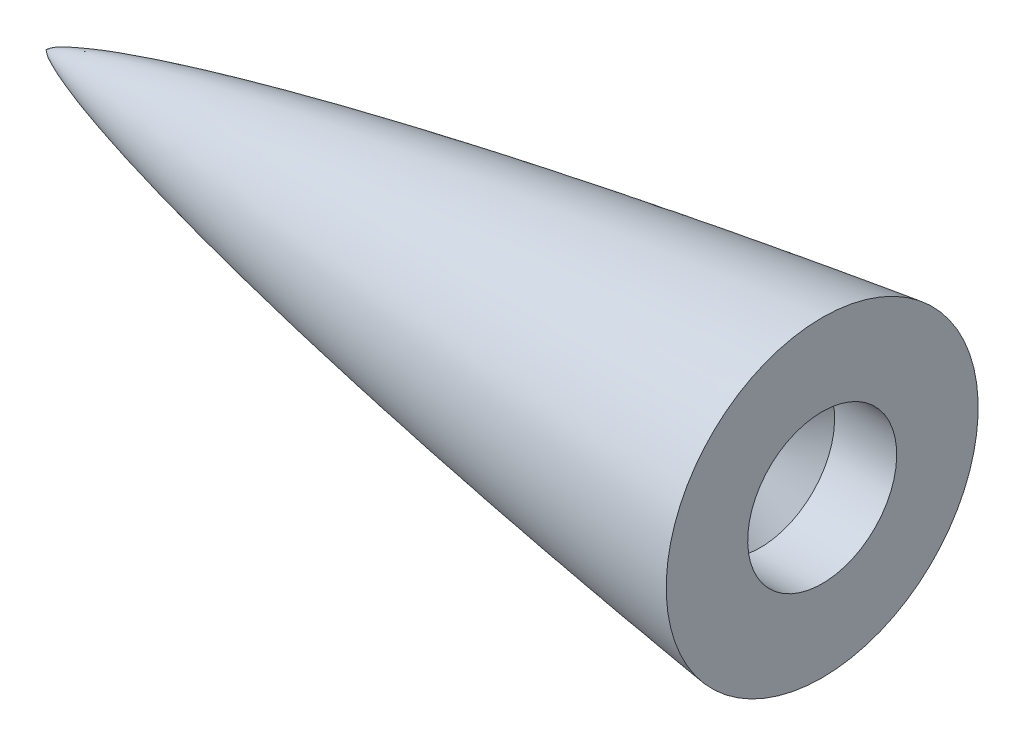
ISO-10303-21;
HEADER;
FILE_DESCRIPTION(('STEP AP214'),'2;1');
FILE_NAME('part.step','',(''),(''),'','','');
FILE_SCHEMA(('AUTOMOTIVE_DESIGN { 1 0 10303 214 1 1 1 1 }'));
ENDSEC;
DATA;
#1=APPLICATION_CONTEXT('core data for automotive mechanical design processes');
#2=APPLICATION_PROTOCOL_DEFINITION('international standard','automotive_design',2000,#1);
#3=PRODUCT_CONTEXT('',#1,'mechanical');
#4=PRODUCT('Part','Part','',(#3));
#5=PRODUCT_RELATED_PRODUCT_CATEGORY('part','',(#4));
#6=PRODUCT_DEFINITION_FORMATION('','',#4);
#7=PRODUCT_DEFINITION_CONTEXT('part definition',#1,'design');
#8=PRODUCT_DEFINITION('design','',#6,#7);
#9=PRODUCT_DEFINITION_SHAPE('','',#8);
#10=(LENGTH_UNIT() NAMED_UNIT(*) SI_UNIT(.MILLI.,.METRE.));
#11=(NAMED_UNIT(*) PLANE_ANGLE_UNIT() SI_UNIT($,.RADIAN.));
#12=(NAMED_UNIT(*) SI_UNIT($,.STERADIAN.) SOLID_ANGLE_UNIT());
#13=UNCERTAINTY_MEASURE_WITH_UNIT(LENGTH_MEASURE(1.E-05),#10,'distance_accuracy_value','');
#14=(GEOMETRIC_REPRESENTATION_CONTEXT(3) GLOBAL_UNCERTAINTY_ASSIGNED_CONTEXT((#13)) GLOBAL_UNIT_ASSIGNED_CONTEXT((#10,
#11,#12)) REPRESENTATION_CONTEXT('',''));
#15=CARTESIAN_POINT('',(0.,0.,0.));
#16=DIRECTION('',(0.,0.,1.));
#17=DIRECTION('',(1.,0.,0.));
#18=AXIS2_PLACEMENT_3D('',#15,#16,#17);
#19=CARTESIAN_POINT('',(0.,0.,0.));
#20=CARTESIAN_POINT('',(0.323780020887397,0.255775241078369,0.));
#21=CARTESIAN_POINT('',(0.940167440278331,0.742700408234434,0.));
#22=CARTESIAN_POINT('',(1.99586647802029,1.20500450304396,0.));
#23=CARTESIAN_POINT('',(2.9891443755303,1.6585574947563,0.));
#24=CARTESIAN_POINT('',(3.99771455141672,2.03983181127441,0.));
#25=CARTESIAN_POINT('',(4.9963829844802,2.41322911768293,0.));
#26=CARTESIAN_POINT('',(5.99863901612366,2.76071011388828,0.));
#27=CARTESIAN_POINT('',(6.99872671672192,3.10038008243236,0.));
#28=CARTESIAN_POINT('',(7.99647459327054,3.43440656378718,0.));
#29=CARTESIAN_POINT('',(9.00081816523889,3.73734633856324,0.));
#30=CARTESIAN_POINT('',(9.99648236750148,4.05503898299552,0.));
#31=CARTESIAN_POINT('',(11.000411881983,4.3386370063871,0.));
#32=CARTESIAN_POINT('',(12.0000264958528,4.62989219414951,0.));
#33=CARTESIAN_POINT('',(12.9986051544376,4.9215380853015,0.));
#34=CARTESIAN_POINT('',(13.9985534469774,5.20195691832947,0.));
#35=CARTESIAN_POINT('',(15.0003334182707,5.46875613142633,0.));
#36=CARTESIAN_POINT('',(15.9984353526339,5.74256519686874,0.));
#37=CARTESIAN_POINT('',(17.0001482189189,5.99945009102783,0.));
#38=CARTESIAN_POINT('',(18.0001446630445,6.25942233061631,0.));
#39=CARTESIAN_POINT('',(18.9984766921585,6.52265059158229,0.));
#40=CARTESIAN_POINT('',(20.000361351775,6.7685531913981,0.));
#41=CARTESIAN_POINT('',(20.998509309663,7.02274455824322,0.));
#42=CARTESIAN_POINT('',(22.0002089755978,7.25914577508987,0.));
#43=CARTESIAN_POINT('',(22.9998827761935,7.50049014654998,0.));
#44=CARTESIAN_POINT('',(24.0002599196283,7.73889363871019,0.));
#45=CARTESIAN_POINT('',(24.9983369265945,7.98375360133974,0.));
#46=CARTESIAN_POINT('',(26.0019384064253,8.2050455229291,0.));
#47=CARTESIAN_POINT('',(26.9969102517336,8.45676294554457,0.));
#48=CARTESIAN_POINT('',(28.0016843871117,8.66589031137831,0.));
#49=CARTESIAN_POINT('',(28.9998897748322,8.90047907289533,0.));
#50=CARTESIAN_POINT('',(29.9987560419627,9.1321954467473,0.));
#51=CARTESIAN_POINT('',(31.0000886415689,9.34961701744224,0.));
#52=CARTESIAN_POINT('',(32.0001743406456,9.5691812228472,0.));
#53=CARTESIAN_POINT('',(32.9985303693005,9.79350448530771,0.));
#54=CARTESIAN_POINT('',(34.0015943584278,9.99591673292078,0.));
#55=CARTESIAN_POINT('',(34.9985171107659,10.2235650355828,0.));
#56=CARTESIAN_POINT('',(36.0002270352643,10.4289406273334,0.));
#57=CARTESIAN_POINT('',(36.9998883550317,10.6405317273191,0.));
#58=CARTESIAN_POINT('',(38.000219544609,10.8489324633901,0.));
#59=CARTESIAN_POINT('',(38.9985789976079,11.0635976965344,0.));
#60=CARTESIAN_POINT('',(40.0015301218619,11.2558691369272,0.));
#61=CARTESIAN_POINT('',(40.9985793142961,11.4735978983808,0.));
#62=CARTESIAN_POINT('',(42.0002178473467,11.6689337563659,0.));
#63=CARTESIAN_POINT('',(42.9998922470854,11.8705389408343,0.));
#64=CARTESIAN_POINT('',(44.0002131643118,12.0689104802971,0.));
#65=CARTESIAN_POINT('',(44.9986301079839,12.2736909497769,0.));
#66=CARTESIAN_POINT('',(46.0015094902387,12.4555924159893,0.));
#67=CARTESIAN_POINT('',(46.9984625439728,12.6645512426057,0.));
#68=CARTESIAN_POINT('',(48.0015094586317,12.8455921048063,0.));
#69=CARTESIAN_POINT('',(48.9986307600539,13.0536894987703,0.));
#70=CARTESIAN_POINT('',(50.0002103177637,13.2389179790492,0.));
#71=CARTESIAN_POINT('',(50.9999006087651,13.430522563333,0.));
#72=CARTESIAN_POINT('',(52.000187247176,13.6189917676189,0.));
#73=CARTESIAN_POINT('',(52.9987551880939,13.8133944889421,0.));
#74=CARTESIAN_POINT('',(54.0012149112962,13.9867663694642,0.));
#75=CARTESIAN_POINT('',(54.9999626307905,14.1802019233818,0.));
#76=CARTESIAN_POINT('',(55.9989344319738,14.3724266587387,0.));
#77=CARTESIAN_POINT('',(57.0001255770618,14.549321163093,0.));
#78=CARTESIAN_POINT('',(57.9999661258012,14.7301831848409,0.));
#79=CARTESIAN_POINT('',(59.0000099197334,14.9099460975432,0.));
#80=CARTESIAN_POINT('',(59.9999941952651,15.0900324249862,0.));
#81=CARTESIAN_POINT('',(61.0000132992063,15.2699242025121,0.));
#82=CARTESIAN_POINT('',(61.9999526079096,15.4502707649654,0.));
#83=CARTESIAN_POINT('',(63.0001762691555,15.6289927376263,0.));
#84=CARTESIAN_POINT('',(63.998777280903,15.8136537984722,0.));
#85=CARTESIAN_POINT('',(65.0013188228629,15.975797021322,0.));
#86=CARTESIAN_POINT('',(65.9987773605775,16.1636533453202,0.));
#87=CARTESIAN_POINT('',(67.0001756793598,16.3289960993631,0.));
#88=CARTESIAN_POINT('',(67.99995298384,16.5002686490075,0.));
#89=CARTESIAN_POINT('',(69.0000123852801,16.6699293046071,0.));
#90=CARTESIAN_POINT('',(69.9999974750394,16.8400141325643,0.));
#91=CARTESIAN_POINT('',(70.9999977145622,17.0100141651359,0.));
#92=CARTESIAN_POINT('',(72.0000116667117,17.1799292068923,0.));
#93=CARTESIAN_POINT('',(72.999955618591,17.3502690072949,0.));
#94=CARTESIAN_POINT('',(74.0001658589244,17.5189947639282,0.));
#95=CARTESIAN_POINT('',(74.9988463848556,17.6936584452655,0.));
#96=CARTESIAN_POINT('',(76.0012362703805,17.8458406031963,0.));
#97=CARTESIAN_POINT('',(76.9988856394752,18.0234205297845,0.));
#98=CARTESIAN_POINT('',(78.0000088884917,18.1799461346581,0.));
#99=CARTESIAN_POINT('',(79.001078777981,18.3367951047628,0.));
#100=CARTESIAN_POINT('',(79.9988883972105,18.5134038960239,0.));
#101=CARTESIAN_POINT('',(81.0001548669461,18.6690610960767,0.));
#102=CARTESIAN_POINT('',(81.9999559029511,18.8302683568656,0.));
#103=CARTESIAN_POINT('',(83.0000215212496,18.9898654764607,0.));
#104=CARTESIAN_POINT('',(83.9999580120505,19.1502697372915,0.));
#105=CARTESIAN_POINT('',(85.0001464305484,19.3090555743733,0.));
#106=CARTESIAN_POINT('',(85.9989524622996,19.4734250563118,0.));
#107=CARTESIAN_POINT('',(87.0010167888937,19.6167732671167,0.));
#108=CARTESIAN_POINT('',(88.0000076396623,19.7799507047079,0.));
#109=CARTESIAN_POINT('',(88.9989526755665,19.943423764938,0.));
#110=CARTESIAN_POINT('',(90.0011543081678,20.0858860020574,0.));
#111=CARTESIAN_POINT('',(90.9989527575847,20.2534232327909,0.));
#112=CARTESIAN_POINT('',(92.0000076124893,20.3999508919617,0.));
#113=CARTESIAN_POINT('',(93.0010167693962,20.5467733481348,0.));
#114=CARTESIAN_POINT('',(93.9989524512479,20.7134252947767,0.));
#115=CARTESIAN_POINT('',(95.0001459585646,20.8590579956404,0.));
#116=CARTESIAN_POINT('',(95.999958451924,21.010269227626,0.));
#117=CARTESIAN_POINT('',(97.0000202337396,21.1598650938555,0.));
#118=CARTESIAN_POINT('',(97.9999606131178,21.3102703969518,0.));
#119=CARTESIAN_POINT('',(99.0001373137893,21.4590533183373,0.));
#120=CARTESIAN_POINT('',(99.9990174045867,21.6134432635547,0.));
#121=CARTESIAN_POINT('',(101.00095308829,21.7467601736101,0.));
#122=CARTESIAN_POINT('',(102.00001051548,21.8999274712614,0.));
#123=CARTESIAN_POINT('',(102.999004879635,22.0535297354932,0.));
#124=CARTESIAN_POINT('',(104.00112957346,22.185542980329,0.));
#125=CARTESIAN_POINT('',(104.998843482188,22.3446428470258,0.));
#126=CARTESIAN_POINT('',(106.001129650996,22.4755424458966,0.));
#127=CARTESIAN_POINT('',(106.999004951579,22.633529238071,0.));
#128=CARTESIAN_POINT('',(108.000010502408,22.7699275660932,0.));
#129=CARTESIAN_POINT('',(109.000953008938,22.9067607034301,0.));
#130=CARTESIAN_POINT('',(109.999017621604,23.0634418318312,0.));
#131=CARTESIAN_POINT('',(111.000136053249,23.1990617687087,0.));
#132=CARTESIAN_POINT('',(111.999964154621,23.3402468798406,0.));
#133=CARTESIAN_POINT('',(113.000007328267,23.4799507119288,0.));
#134=CARTESIAN_POINT('',(114.000006532313,23.619950272444,0.));
#135=CARTESIAN_POINT('',(114.999966542483,23.7602481982951,0.));
#136=CARTESIAN_POINT('',(116.000127297756,23.8990569343756,0.));
#137=CARTESIAN_POINT('',(116.999082890696,24.043460261433,0.));
#138=CARTESIAN_POINT('',(118.000889733957,24.1667425427165,0.));
#139=CARTESIAN_POINT('',(119.000009833305,24.3099271607634,0.));
#140=CARTESIAN_POINT('',(119.999070958879,24.4535486212167,0.));
#141=CARTESIAN_POINT('',(121.001054567191,24.5755215328486,0.));
#142=CARTESIAN_POINT('',(121.998920281029,24.7246647812938,0.));
#143=CARTESIAN_POINT('',(123.001054633441,24.8455210420068,0.));
#144=CARTESIAN_POINT('',(123.999071026904,24.9935481176773,0.));
#145=CARTESIAN_POINT('',(125.000009801949,25.119927391691,0.));
#146=CARTESIAN_POINT('',(126.000889739294,25.2467425082154,0.));
#147=CARTESIAN_POINT('',(126.999082801973,25.3934608999027,0.));
#148=CARTESIAN_POINT('',(128.000127237149,25.5190574535096,0.));
#149=CARTESIAN_POINT('',(128.999965755197,25.6502537682925,0.));
#150=CARTESIAN_POINT('',(130.000009742062,25.7799274733206,0.));
#151=CARTESIAN_POINT('',(130.999995276554,25.9100363384253,0.));
#152=CARTESIAN_POINT('',(132.000009151721,26.0399271729781,0.));
#153=CARTESIAN_POINT('',(132.999968116563,26.1702549696623,0.));
#154=CARTESIAN_POINT('',(134.000118382027,26.2990529483729,0.));
#155=CARTESIAN_POINT('',(134.999148590769,26.4334781007121,0.));
#156=CARTESIAN_POINT('',(136.00082595212,26.5467255557261,0.));
#157=CARTESIAN_POINT('',(137.000009123058,26.6799270132021,0.));
#158=CARTESIAN_POINT('',(137.99913757809,26.8135662119206,0.));
#159=CARTESIAN_POINT('',(139.00097895256,26.9255015200354,0.));
#160=CARTESIAN_POINT('',(139.99899770112,27.0646852550941,0.));
#161=CARTESIAN_POINT('',(141.000979009967,27.1755010608001,0.));
#162=CARTESIAN_POINT('',(141.99913763544,27.3135657529733,0.));
#163=CARTESIAN_POINT('',(143.000009100803,27.4299271917738,0.));
#164=CARTESIAN_POINT('',(144.000825938934,27.5467256592578,0.));
#165=CARTESIAN_POINT('',(144.999148580649,27.6834781889812,0.));
#166=CARTESIAN_POINT('',(146.000118081977,27.7990553215228,0.));
#167=CARTESIAN_POINT('',(146.99996836299,27.9202531000893,0.));
#168=CARTESIAN_POINT('',(148.000008466062,28.03993227812,0.));
#169=CARTESIAN_POINT('',(148.999997772763,28.1600177874309,0.));
#170=CARTESIAN_POINT('',(150.000000442888,28.2799965721566,0.));
#171=CARTESIAN_POINT('',(151.000000455687,28.3999959239429,0.));
#172=CARTESIAN_POINT('',(151.999997734364,28.520019732072,0.));
#173=CARTESIAN_POINT('',(153.000008606857,28.6399251477691,0.));
#174=CARTESIAN_POINT('',(153.999967838206,28.7602796768517,0.));
#175=CARTESIAN_POINT('',(155.000120040316,28.8789561448239,0.));
#176=CARTESIAN_POINT('',(155.999174109169,29.0038485034232,0.));
#177=CARTESIAN_POINT('',(157.000913634555,29.105388488964,0.));
#178=CARTESIAN_POINT('',(157.999062851381,29.2348159861766,0.));
#179=CARTESIAN_POINT('',(159.000943327822,29.3351302803103,0.));
#180=CARTESIAN_POINT('',(159.999055434339,29.4648804837719,0.));
#181=CARTESIAN_POINT('',(161.000943330796,29.5651302544485,0.));
#182=CARTESIAN_POINT('',(161.999062853516,29.694815967602,0.));
#183=CARTESIAN_POINT('',(163.000913679169,29.7953881010382,0.));
#184=CARTESIAN_POINT('',(163.999174139061,29.9238482433789,0.));
#185=CARTESIAN_POINT('',(165.000119803179,30.0289582073525,0.));
#186=CARTESIAN_POINT('',(165.999967898109,30.1402791544115,0.));
#187=CARTESIAN_POINT('',(167.000008604385,30.2499251750013,0.));
#188=CARTESIAN_POINT('',(167.999997684352,30.3600201455834,0.));
#189=CARTESIAN_POINT('',(169.000000658206,30.4699942426651,0.));
#190=CARTESIAN_POINT('',(169.999999682824,30.5800028837563,0.));
#191=CARTESIAN_POINT('',(171.000000610498,30.6899942223099,0.));
#192=CARTESIAN_POINT('',(171.999997875184,30.8000202270043,0.));
#193=CARTESIAN_POINT('',(173.000007888766,30.9099248696732,0.));
#194=CARTESIAN_POINT('',(173.999970569752,31.0202802943031,0.));
#195=CARTESIAN_POINT('',(175.000109832227,31.1289539531143,0.));
#196=CARTESIAN_POINT('',(175.999244285965,31.2438641211122,0.));
#197=CARTESIAN_POINT('',(177.000836004758,31.3353711863905,0.));
#198=CARTESIAN_POINT('',(177.99914248156,31.4548337108929,0.));
#199=CARTESIAN_POINT('',(179.000863170811,31.5451124556522,0.));
#200=CARTESIAN_POINT('',(179.999135704011,31.6648982606242,0.));
#201=CARTESIAN_POINT('',(181.000863138489,31.75511276333,0.));
#202=CARTESIAN_POINT('',(181.999142622705,31.8748323672917,0.));
#203=CARTESIAN_POINT('',(183.000835519916,31.9653758015584,0.));
#204=CARTESIAN_POINT('',(183.999246261986,32.0838453106908,0.));
#205=CARTESIAN_POINT('',(185.000102360935,32.179025075384,0.));
#206=CARTESIAN_POINT('',(185.99999776307,32.2800214332274,0.));
#207=CARTESIAN_POINT('',(186.999906586783,32.3808891917066,0.));
#208=CARTESIAN_POINT('',(188.000722407055,32.4764548881151,0.));
#209=CARTESIAN_POINT('',(188.999280935262,32.5935083786063,0.));
#210=CARTESIAN_POINT('',(190.00007672591,32.6892942078649,0.));
#211=CARTESIAN_POINT('',(191.000065650777,32.7892816255474,0.));
#212=CARTESIAN_POINT('',(191.999347119071,32.8935465739644,0.));
#213=CARTESIAN_POINT('',(193.000662965168,32.9763526207561,0.));
#214=CARTESIAN_POINT('',(193.999883861523,33.0812230656851,0.));
#215=CARTESIAN_POINT('',(195.000115121645,33.178788022476,0.));
#216=CARTESIAN_POINT('',(195.999342117077,33.2835919593074,0.));
#217=CARTESIAN_POINT('',(197.000633581217,33.366663882023,0.));
#218=CARTESIAN_POINT('',(198.000006547159,33.4699310835378,0.));
#219=CARTESIAN_POINT('',(198.99934024247,33.57361165412,0.));
#220=CARTESIAN_POINT('',(200.000749444591,33.6554442476242,0.));
#221=CARTESIAN_POINT('',(200.999231026767,33.7647613223023,0.));
#222=CARTESIAN_POINT('',(202.000757308872,33.8453614633098,0.));
#223=CARTESIAN_POINT('',(202.99930893216,33.9539412459336,0.));
#224=CARTESIAN_POINT('',(204.000123948022,34.0386952489818,0.));
#225=CARTESIAN_POINT('',(204.999881144082,34.1312511559038,0.));
#226=CARTESIAN_POINT('',(206.000665597728,34.2163268306034,0.));
#227=CARTESIAN_POINT('',(206.999339541847,34.3236191691468,0.));
#228=CARTESIAN_POINT('',(208.000093191885,34.4090184897275,0.));
#229=CARTESIAN_POINT('',(208.999973578202,34.5002800671583,0.));
#230=CARTESIAN_POINT('',(210.000012495305,34.5898612416392,0.));
#231=CARTESIAN_POINT('',(210.999976440576,34.6802749662848,0.));
#232=CARTESIAN_POINT('',(212.000081742389,34.7690388932218,0.));
#233=CARTESIAN_POINT('',(212.999415522799,34.8635428811616,0.));
#234=CARTESIAN_POINT('',(214.000568484554,34.9366451562588,0.));
#235=CARTESIAN_POINT('',(214.999998315379,35.0300198081694,0.));
#236=CARTESIAN_POINT('',(215.999438251088,35.1232756444808,0.));
#237=CARTESIAN_POINT('',(217.000560915238,35.1967341659276,0.));
#238=CARTESIAN_POINT('',(218.00000585792,35.2899310817981,0.));
#239=CARTESIAN_POINT('',(218.999415662964,35.3835413906112,0.));
#240=CARTESIAN_POINT('',(220.000643680752,35.4557604306458,0.));
#241=CARTESIAN_POINT('',(220.999416084509,35.553536431245,0.));
#242=CARTESIAN_POINT('',(222.000004263714,35.6299498372023,0.));
#243=CARTESIAN_POINT('',(223.000566853437,35.7066643046445,0.));
#244=CARTESIAN_POINT('',(223.999416068847,35.8035366124538,0.));
#245=CARTESIAN_POINT('',(225.000081024051,35.8790467633719,0.));
#246=CARTESIAN_POINT('',(225.999978314306,35.9602550905182,0.));
#247=CARTESIAN_POINT('',(227.000005718728,36.0399328745553,0.));
#248=CARTESIAN_POINT('',(227.999998810784,36.1200134112607,0.));
#249=CARTESIAN_POINT('',(228.999999038136,36.200013480402,0.));
#250=CARTESIAN_POINT('',(230.000005036672,36.2799326671315,0.));
#251=CARTESIAN_POINT('',(230.999980815175,36.3602558510721,0.));
#252=CARTESIAN_POINT('',(232.000071702628,36.4390439285801,0.));
#253=CARTESIAN_POINT('',(232.99948395583,36.5235474300306,0.));
#254=CARTESIAN_POINT('',(234.000500965727,36.5866536233432,0.));
#255=CARTESIAN_POINT('',(235.000003768349,36.6699497543356,0.));
#256=CARTESIAN_POINT('',(235.999483966494,36.7535472843972,0.));
#257=CARTESIAN_POINT('',(237.000568756118,36.8157497298935,0.));
#258=CARTESIAN_POINT('',(237.999483986515,36.9035470175816,0.));
#259=CARTESIAN_POINT('',(239.000003761308,36.96994984772,0.));
#260=CARTESIAN_POINT('',(240.000500962643,37.0366536663721,0.));
#261=CARTESIAN_POINT('',(240.999483947094,37.1235475394051,0.));
#262=CARTESIAN_POINT('',(242.000071611276,37.1890451731743,0.));
#263=CARTESIAN_POINT('',(242.999980835321,37.2602554834586,0.));
#264=CARTESIAN_POINT('',(244.00000504744,37.3299328929912,0.));
#265=CARTESIAN_POINT('',(244.999998974919,37.4000129445766,0.));
#266=CARTESIAN_POINT('',(245.999999052883,37.4700153287023,0.));
#267=CARTESIAN_POINT('',(247.000004813551,37.5399257406143,0.));
#268=CARTESIAN_POINT('',(247.999981692915,37.6102817088406,0.));
#269=CARTESIAN_POINT('',(249.000068414788,37.6789474240234,0.));
#270=CARTESIAN_POINT('',(249.999529037808,37.7539124231305,0.));
#271=CARTESIAN_POINT('',(251.000520947229,37.805318559985,0.));
#272=CARTESIAN_POINT('',(251.999465888063,37.8848839783196,0.));
#273=CARTESIAN_POINT('',(253.000536743146,37.9350755405134,0.));
#274=CARTESIAN_POINT('',(253.999465888207,38.0148839769165,0.));
#275=CARTESIAN_POINT('',(255.000520963684,38.0653183035788,0.));
#276=CARTESIAN_POINT('',(255.999529039968,38.1439124020842,0.));
#277=CARTESIAN_POINT('',(257.00006836588,38.1989481310445,0.));
#278=CARTESIAN_POINT('',(257.99998160711,38.2602831985117,0.));
#279=CARTESIAN_POINT('',(259.000005205678,38.3199190749085,0.));
#280=CARTESIAN_POINT('',(259.999997570176,38.3800405018543,0.));
#281=CARTESIAN_POINT('',(261.000004513617,38.4399189176743,0.));
#282=CARTESIAN_POINT('',(261.999984375355,38.5002838274485,0.));
#283=CARTESIAN_POINT('',(263.000057984962,38.5589457725319,0.));
#284=CARTESIAN_POINT('',(263.999601009135,38.6239212075669,0.));
#285=CARTESIAN_POINT('',(265.000441331696,38.6653089270093,0.));
#286=CARTESIAN_POINT('',(265.999547519095,38.7348937912328,0.));
#287=CARTESIAN_POINT('',(267.000454706354,38.7750657567894,0.));
#288=CARTESIAN_POINT('',(267.999547534952,38.8448934438272,0.));
#289=CARTESIAN_POINT('',(269.000441280514,38.8853100938704,0.));
#290=CARTESIAN_POINT('',(269.999601246991,38.953915996482,0.));
#291=CARTESIAN_POINT('',(271.000057068166,38.9989657486842,0.));
#292=CARTESIAN_POINT('',(271.999987604439,39.0502127740205,0.));
#293=CARTESIAN_POINT('',(272.99999251408,39.1001831552339,0.));
#294=CARTESIAN_POINT('',(274.000042339241,39.1490546050439,0.));
#295=CARTESIAN_POINT('',(274.999688499988,39.2035902615881,0.));
#296=CARTESIAN_POINT('',(276.000305523638,39.2365434479416,0.));
#297=CARTESIAN_POINT('',(276.999987561426,39.2902764268363,0.));
#298=CARTESIAN_POINT('',(277.999744219491,39.3423510929327,0.));
#299=CARTESIAN_POINT('',(278.99998770852,39.3802720516552,0.));
#300=CARTESIAN_POINT('',(280.000304957471,39.4165604560462,0.));
#301=CARTESIAN_POINT('',(280.999690624,39.4735264571226,0.));
#302=CARTESIAN_POINT('',(282.000034370243,39.5092936556209,0.));
#303=CARTESIAN_POINT('',(283.000022139228,39.5492935658888,0.));
#304=CARTESIAN_POINT('',(283.99976058909,39.5935269270077,0.));
#305=CARTESIAN_POINT('',(285.000236387071,39.6165739750987,0.));
#306=CARTESIAN_POINT('',(285.999992987368,39.6602016766098,0.));
#307=CARTESIAN_POINT('',(286.999791658556,39.7026194594347,0.));
#308=CARTESIAN_POINT('',(288.000024718304,39.729292309718,0.));
#309=CARTESIAN_POINT('',(288.999992913261,39.7602081935645,0.));
#310=CARTESIAN_POINT('',(290.000003628653,39.7898749160238,0.));
#311=CARTESIAN_POINT('',(290.999992572128,39.8202921423401,0.));
#312=CARTESIAN_POINT('',(292.000026082836,39.8489565146159,0.));
#313=CARTESIAN_POINT('',(292.999819837969,39.8838788910099,0.));
#314=CARTESIAN_POINT('',(294.000194892896,39.8955153204743,0.));
#315=CARTESIAN_POINT('',(294.999816985873,39.9340702766527,0.));
#316=CARTESIAN_POINT('',(296.000037481987,39.9481914297313,0.));
#317=CARTESIAN_POINT('',(296.999899805772,39.9731615802105,0.));
#318=CARTESIAN_POINT('',(298.000013386612,39.9791568320251,0.));
#319=CARTESIAN_POINT('',(298.999996653347,39.9902107919937,0.));
#320=CARTESIAN_POINT('',(299.666665551116,39.9967369306646,0.));
#321=CARTESIAN_POINT('',(300.,40.,0.));
#322=B_SPLINE_CURVE_WITH_KNOTS('',3,(#19,#20,#21,#22,#23,#24,#25,#26,#27,#28,#29,#30,#31,#32,
#33,#34,#35,#36,#37,#38,#39,#40,#41,#42,#43,#44,#45,#46,#47,#48,#49,#50,#51,#52,#53,#54,#55,#56,
#57,#58,#59,#60,#61,#62,#63,#64,#65,#66,#67,#68,#69,#70,#71,#72,#73,#74,#75,#76,#77,#78,#79,#80,
#81,#82,#83,#84,#85,#86,#87,#88,#89,#90,#91,#92,#93,#94,#95,#96,#97,#98,#99,#100,#101,#102,#103,
#104,#105,#106,#107,#108,#109,#110,#111,#112,#113,#114,#115,#116,#117,#118,#119,#120,#121,#122,
#123,#124,#125,#126,#127,#128,#129,#130,#131,#132,#133,#134,#135,#136,#137,#138,#139,#140,#141,
#142,#143,#144,#145,#146,#147,#148,#149,#150,#151,#152,#153,#154,#155,#156,#157,#158,#159,#160,
#161,#162,#163,#164,#165,#166,#167,#168,#169,#170,#171,#172,#173,#174,#175,#176,#177,#178,#179,
#180,#181,#182,#183,#184,#185,#186,#187,#188,#189,#190,#191,#192,#193,#194,#195,#196,#197,#198,
#199,#200,#201,#202,#203,#204,#205,#206,#207,#208,#209,#210,#211,#212,#213,#214,#215,#216,#217,
#218,#219,#220,#221,#222,#223,#224,#225,#226,#227,#228,#229,#230,#231,#232,#233,#234,#235,#236,
#237,#238,#239,#240,#241,#242,#243,#244,#245,#246,#247,#248,#249,#250,#251,#252,#253,#254,#255,
#256,#257,#258,#259,#260,#261,#262,#263,#264,#265,#266,#267,#268,#269,#270,#271,#272,#273,#274,
#275,#276,#277,#278,#279,#280,#281,#282,#283,#284,#285,#286,#287,#288,#289,#290,#291,#292,#293,
#294,#295,#296,#297,#298,#299,#300,#301,#302,#303,#304,#305,#306,#307,#308,#309,#310,#311,#312,
#313,#314,#315,#316,#317,#318,#319,#320,#321),.UNSPECIFIED.,.F.,.F.,(4,1,1,1,1,1,1,1,1,1,1,1,1,
1,1,1,1,1,1,1,1,1,1,1,1,1,1,1,1,1,1,1,1,1,1,1,1,1,1,1,1,1,1,1,1,1,1,1,1,1,1,1,1,1,1,1,1,1,1,1,1,
1,1,1,1,1,1,1,1,1,1,1,1,1,1,1,1,1,1,1,1,1,1,1,1,1,1,1,1,1,1,1,1,1,1,1,1,1,1,1,1,1,1,1,1,1,1,1,1,
1,1,1,1,1,1,1,1,1,1,1,1,1,1,1,1,1,1,1,1,1,1,1,1,1,1,1,1,1,1,1,1,1,1,1,1,1,1,1,1,1,1,1,1,1,1,1,1,
1,1,1,1,1,1,1,1,1,1,1,1,1,1,1,1,1,1,1,1,1,1,1,1,1,1,1,1,1,1,1,1,1,1,1,1,1,1,1,1,1,1,1,1,1,1,1,1,
1,1,1,1,1,1,1,1,1,1,1,1,1,1,1,1,1,1,1,1,1,1,1,1,1,1,1,1,1,1,1,1,1,1,1,1,1,1,1,1,1,1,1,1,1,1,1,1,
1,1,1,1,1,1,1,1,1,1,1,1,1,1,1,1,1,1,1,1,1,1,1,1,1,1,1,1,1,1,1,1,1,1,1,1,1,1,1,1,1,1,1,1,1,1,1,
4),(0.,0.00405928364621406,0.00772775097242914,0.0113267829602198,0.0148626944872316,
0.0183752033991811,0.021865396666398,0.0253448463005576,0.0288138318705567,0.0322627381295801,
0.0357116443886035,0.0391416195399031,0.0425715946912028,0.0460015698425024,0.0494225160182203,
0.0528347273759571,0.0562469387336939,0.0596507116956672,0.0630544846576405,0.0664582576196138,
0.0698538908179343,0.0732495240162549,0.0766373182355804,0.0800251124549059,0.0834129066742315,
0.086800700893557,0.0901809590111477,0.0935687532304732,0.0969417801536779,0.100322038271269,
0.103702296388859,0.107075323312064,0.110448350235269,0.113821377158473,0.117187479759683,
0.120560506682888,0.123926609284098,0.127292711885308,0.130658814486518,0.134024917087728,
0.137384404136842,0.140750506738052,0.144109993787166,0.14746948083628,0.150828967885394,
0.154188454934508,0.157541637028959,0.160901124078073,0.164254306172523,0.167613793221637,
0.170966975316087,0.174320157410537,0.177673339504987,0.181026521599437,0.184373711091832,
0.187726893186282,0.191080075280732,0.194427264773127,0.197774454265522,0.201121643757917,
0.204468833250312,0.207816022742707,0.211163212235102,0.214510401727497,0.217857591219892,
0.221199102143343,0.224546291635738,0.227887802559189,0.23122931348264,0.234570824406091,
0.237912335329542,0.241253846252993,0.244595357176444,0.247936868099895,0.251278379023346,
0.254619889946797,0.257956037937994,0.261297548861445,0.264633696852641,0.267969844843838,
0.271311355767289,0.274647503758486,0.277983651749683,0.28131979974088,0.284655947732077,
0.287992095723274,0.291328243714471,0.294659345934589,0.297995493925786,0.301331641916983,
0.304662744137101,0.307998892128298,0.311329994348416,0.314661096568534,0.317997244559731,
0.321328346779849,0.324659448999968,0.327990551220086,0.331321653440204,0.334652755660322,
0.33798385788044,0.341310232933958,0.344641335154077,0.347972437374195,0.351298812427713,
0.354629914647831,0.357956289701349,0.361287391921468,0.364613766974986,0.367940142028504,
0.371271244248622,0.37459761930214,0.377923994355659,0.381250369409177,0.384576744462695,
0.387903119516213,0.391229494569732,0.39455586962325,0.397877837474772,0.40120421252829,
0.404530587581808,0.40785255543333,0.411178930486848,0.41450089833837,0.417827273391888,
0.42114924124341,0.424471209094931,0.42779758414845,0.431119551999971,0.434441519851493,
0.437763487703015,0.441085455554537,0.444407423406058,0.44772939125758,0.451051359109102,
0.454373326960624,0.457691208849797,0.461013176701318,0.46433514455284,0.467653026442013,
0.470974994293535,0.474292876182708,0.47761484403423,0.480932725923403,0.484250607812576,
0.487572575664098,0.490890457553271,0.494208339442444,0.497526221331617,0.50084410322079,
0.504161985109963,0.507479866999136,0.510797748888309,0.514115630777482,0.517433512666655,
0.520751394555828,0.524069276445001,0.527383394799638,0.530701276688812,0.534015395043449,
0.537333276932622,0.540647395287259,0.543965277176433,0.54727939553107,0.550597277420243,
0.55391139577488,0.557225514129518,0.560539632484155,0.563853750838793,0.56716786919343,
0.570481987548067,0.573796105902705,0.577110224257342,0.58042434261198,0.583738460966617,
0.587052579321254,0.590366697675892,0.593677376023402,0.596991494378039,0.600302172725549,
0.603616291080186,0.606926969427696,0.610241087782333,0.613551766129843,0.616865884484481,
0.62017656283199,0.6234872411795,0.62679791952701,0.63010859787452,0.633422716229157,
0.636733394576667,0.640044072924177,0.643354751271686,0.646662314148924,0.649972992496433,
0.653283670843943,0.656594349191453,0.65990191206869,0.6632125904162,0.66652326876371,
0.669830831640947,0.673141509988457,0.676449072865694,0.679759751213204,0.683067314090441,
0.686374876967679,0.689682439844916,0.692993118192426,0.696300681069663,0.6996082439469,
0.702915806824138,0.706223369701375,0.709530932578612,0.71283849545585,0.716143268317511,
0.719450831194748,0.722758394071985,0.726063166933646,0.729370729810884,0.732678292688121,
0.735983065549782,0.739290628427019,0.74259540128868,0.745900174150341,0.749207737027578,
0.752512509889239,0.7558172827509,0.759122055612561,0.762426828474222,0.765731601335883,
0.769036374197544,0.772341147059205,0.775645919920866,0.778950692782527,0.782253001908206,
0.785557774769867,0.788862547631528,0.792164856757207,0.795469629618868,0.798771938744548,
0.802074247870227,0.805379020731888,0.808681329857567,0.811983638983247,0.815285948108926,
0.818588257234606,0.821890566360285,0.825192875485965,0.828495184611644,0.831797493737323,
0.835099802863003,0.838399975263046,0.841702284388725,0.845002456788768,0.848304765914447,
0.85160493831449,0.854907247440169,0.858207419840212,0.861507592240255,0.864807764640298,
0.868107937040341,0.871408109440384,0.874708281840427,0.87800845424047,0.881308626640512,
0.884606989960789,0.887907162360832,0.891205525681109,0.894505698081152,0.897804061401428,
0.901104233801471,0.904402597121748,0.907700960442024,0.910999323762301,0.914297687082578,
0.917596050402854,0.920892932828597,0.924191296148874,0.92748965946915,0.930786541894893,
0.934083424320636,0.937381787640912,0.940678670066655,0.943975552492398,0.94727243491814,
0.950568165076979,0.953865047502722,0.957161929928464,0.960457660087303,0.963753390246142,
0.967049120404981,0.97034485056382,0.973640580722659,0.976936310881498,0.980231217745837,
0.983526947904676,0.986821854769016,0.990116761633355,0.993411174422237,0.996705587211118,1.),.UNSPECIFIED.);
#323=CARTESIAN_POINT('',(1365.99999999999,1.69593505905396E-13,0.));
#324=DIRECTION('',(1.,0.,0.));
#325=AXIS1_PLACEMENT('',#323,#324);
#326=SURFACE_OF_REVOLUTION('',#322,#325);
#327=CARTESIAN_POINT('',(125.,-1.51978667774186E-13,0.));
#328=DIRECTION('',(1.,0.,0.));
#329=DIRECTION('',(0.,1.,0.));
#330=AXIS2_PLACEMENT_3D('',#327,#328,#329);
#331=CIRCLE('',#330,25.1200000000002);
#332=CARTESIAN_POINT('',(125.,25.12,0.));
#333=VERTEX_POINT('',#332);
#334=EDGE_CURVE('E69',#333,#333,#331,.T.);
#335=ORIENTED_EDGE('',*,*,#334,.F.);
#336=EDGE_LOOP('',(#335));
#337=FACE_BOUND('',#336,.T.);
#338=CARTESIAN_POINT('',(0.,0.,0.));
#339=VERTEX_POINT('',#338);
#340=VERTEX_LOOP('',#339);
#341=FACE_BOUND('',#340,.T.);
#342=ADVANCED_FACE('F45',(#337,#341),#326,.T.);
#343=CARTESIAN_POINT('',(24.9999999999999,-1.77891010536441E-13,0.));
#344=DIRECTION('',(1.,0.,0.));
#345=DIRECTION('',(0.,1.,0.));
#346=AXIS2_PLACEMENT_3D('',#343,#344,#345);
#347=CONICAL_SURFACE('',#346,3.17500000000018,0.785398163397459);
#348=CARTESIAN_POINT('',(21.825,0.,0.));
#349=VERTEX_POINT('',#348);
#350=VERTEX_LOOP('',#349);
#351=FACE_BOUND('',#350,.T.);
#352=CARTESIAN_POINT('',(24.9999999999999,-1.77891010536441E-13,0.));
#353=DIRECTION('',(1.,0.,0.));
#354=DIRECTION('',(0.,1.,0.));
#355=AXIS2_PLACEMENT_3D('',#352,#353,#354);
#356=CIRCLE('',#355,3.17500000000018);
#357=CARTESIAN_POINT('',(24.9999999999999,3.175,0.));
#358=VERTEX_POINT('',#357);
#359=EDGE_CURVE('E11',#358,#358,#356,.T.);
#360=ORIENTED_EDGE('',*,*,#359,.T.);
#361=EDGE_LOOP('',(#360));
#362=FACE_BOUND('',#361,.T.);
#363=ADVANCED_FACE('F61',(#351,#362),#347,.F.);
#364=CARTESIAN_POINT('',(1365.99999999999,1.69593505905396E-13,0.));
#365=DIRECTION('',(1.,0.,0.));
#366=DIRECTION('',(0.,1.,0.));
#367=AXIS2_PLACEMENT_3D('',#364,#365,#366);
#368=CYLINDRICAL_SURFACE('',#367,3.17500000000017);
#369=ORIENTED_EDGE('',*,*,#359,.F.);
#370=EDGE_LOOP('',(#369));
#371=FACE_BOUND('',#370,.T.);
#372=CARTESIAN_POINT('',(106.175,-1.5685666629918E-13,0.));
#373=DIRECTION('',(1.,0.,0.));
#374=DIRECTION('',(0.,1.,0.));
#375=AXIS2_PLACEMENT_3D('',#372,#373,#374);
#376=CIRCLE('',#375,3.17500000000017);
#377=CARTESIAN_POINT('',(106.175,3.175,0.));
#378=VERTEX_POINT('',#377);
#379=EDGE_CURVE('E54',#378,#378,#376,.T.);
#380=ORIENTED_EDGE('',*,*,#379,.T.);
#381=EDGE_LOOP('',(#380));
#382=FACE_BOUND('',#381,.T.);
#383=ADVANCED_FACE('F66',(#371,#382),#368,.F.);
#384=CARTESIAN_POINT('',(115.,-1.54569902050411E-13,0.));
#385=DIRECTION('',(1.,0.,0.));
#386=DIRECTION('',(0.,1.,0.));
#387=AXIS2_PLACEMENT_3D('',#384,#385,#386);
#388=CONICAL_SURFACE('',#387,12.,0.785398163397447);
#389=CARTESIAN_POINT('',(115.,-1.54569902050411E-13,0.));
#390=DIRECTION('',(1.,0.,0.));
#391=DIRECTION('',(0.,1.,0.));
#392=AXIS2_PLACEMENT_3D('',#389,#390,#391);
#393=CIRCLE('',#392,12.);
#394=CARTESIAN_POINT('',(115.,11.9999999999998,0.));
#395=VERTEX_POINT('',#394);
#396=EDGE_CURVE('E76',#395,#395,#393,.T.);
#397=CARTESIAN_POINT('',(106.175,3.175,0.));
#398=CARTESIAN_POINT('',(106.266927083333,3.26692708333334,0.));
#399=CARTESIAN_POINT('',(106.358854166667,3.35885416666667,0.));
#400=CARTESIAN_POINT('',(106.542708333333,3.54270833333333,0.));
#401=CARTESIAN_POINT('',(106.634635416667,3.63463541666666,0.));
#402=CARTESIAN_POINT('',(106.818489583333,3.81848958333333,0.));
#403=CARTESIAN_POINT('',(106.910416666667,3.91041666666666,0.));
#404=CARTESIAN_POINT('',(107.094270833333,4.09427083333332,0.));
#405=CARTESIAN_POINT('',(107.186197916667,4.18619791666665,0.));
#406=CARTESIAN_POINT('',(107.370052083333,4.37005208333332,0.));
#407=CARTESIAN_POINT('',(107.461979166667,4.46197916666665,0.));
#408=CARTESIAN_POINT('',(107.645833333333,4.64583333333331,0.));
#409=CARTESIAN_POINT('',(107.737760416667,4.73776041666664,0.));
#410=CARTESIAN_POINT('',(107.921614583333,4.92161458333331,0.));
#411=CARTESIAN_POINT('',(108.013541666667,5.01354166666664,0.));
#412=CARTESIAN_POINT('',(108.197395833333,5.1973958333333,0.));
#413=CARTESIAN_POINT('',(108.289322916667,5.28932291666663,0.));
#414=CARTESIAN_POINT('',(108.473177083333,5.4731770833333,0.));
#415=CARTESIAN_POINT('',(108.565104166667,5.56510416666663,0.));
#416=CARTESIAN_POINT('',(108.748958333333,5.74895833333329,0.));
#417=CARTESIAN_POINT('',(108.840885416667,5.84088541666662,0.));
#418=CARTESIAN_POINT('',(109.024739583333,6.02473958333329,0.));
#419=CARTESIAN_POINT('',(109.116666666667,6.11666666666662,0.));
#420=CARTESIAN_POINT('',(109.300520833333,6.30052083333328,0.));
#421=CARTESIAN_POINT('',(109.392447916667,6.39244791666661,0.));
#422=CARTESIAN_POINT('',(109.576302083333,6.57630208333327,0.));
#423=CARTESIAN_POINT('',(109.668229166667,6.66822916666661,0.));
#424=CARTESIAN_POINT('',(109.852083333333,6.85208333333327,0.));
#425=CARTESIAN_POINT('',(109.944010416667,6.9440104166666,0.));
#426=CARTESIAN_POINT('',(110.127864583333,7.12786458333327,0.));
#427=CARTESIAN_POINT('',(110.219791666667,7.2197916666666,0.));
#428=CARTESIAN_POINT('',(110.403645833333,7.40364583333326,0.));
#429=CARTESIAN_POINT('',(110.495572916667,7.49557291666659,0.));
#430=CARTESIAN_POINT('',(110.679427083333,7.67942708333325,0.));
#431=CARTESIAN_POINT('',(110.771354166667,7.77135416666658,0.));
#432=CARTESIAN_POINT('',(110.955208333333,7.95520833333325,0.));
#433=CARTESIAN_POINT('',(111.047135416667,8.04713541666658,0.));
#434=CARTESIAN_POINT('',(111.230989583333,8.23098958333324,0.));
#435=CARTESIAN_POINT('',(111.322916666667,8.32291666666657,0.));
#436=CARTESIAN_POINT('',(111.506770833333,8.50677083333324,0.));
#437=CARTESIAN_POINT('',(111.598697916667,8.59869791666657,0.));
#438=CARTESIAN_POINT('',(111.782552083333,8.78255208333323,0.));
#439=CARTESIAN_POINT('',(111.874479166667,8.87447916666657,0.));
#440=CARTESIAN_POINT('',(112.058333333333,9.05833333333323,0.));
#441=CARTESIAN_POINT('',(112.150260416667,9.15026041666656,0.));
#442=CARTESIAN_POINT('',(112.334114583333,9.33411458333322,0.));
#443=CARTESIAN_POINT('',(112.426041666667,9.42604166666655,0.));
#444=CARTESIAN_POINT('',(112.609895833333,9.60989583333322,0.));
#445=CARTESIAN_POINT('',(112.701822916667,9.70182291666655,0.));
#446=CARTESIAN_POINT('',(112.885677083333,9.88567708333321,0.));
#447=CARTESIAN_POINT('',(112.977604166667,9.97760416666654,0.));
#448=CARTESIAN_POINT('',(113.161458333333,10.1614583333332,0.));
#449=CARTESIAN_POINT('',(113.253385416667,10.2533854166665,0.));
#450=CARTESIAN_POINT('',(113.437239583333,10.4372395833332,0.));
#451=CARTESIAN_POINT('',(113.529166666667,10.5291666666665,0.));
#452=CARTESIAN_POINT('',(113.713020833333,10.7130208333332,0.));
#453=CARTESIAN_POINT('',(113.804947916667,10.8049479166665,0.));
#454=CARTESIAN_POINT('',(113.988802083333,10.9888020833332,0.));
#455=CARTESIAN_POINT('',(114.080729166667,11.0807291666665,0.));
#456=CARTESIAN_POINT('',(114.264583333333,11.2645833333332,0.));
#457=CARTESIAN_POINT('',(114.356510416667,11.3565104166665,0.));
#458=CARTESIAN_POINT('',(114.540364583333,11.5403645833332,0.));
#459=CARTESIAN_POINT('',(114.632291666667,11.6322916666665,0.));
#460=CARTESIAN_POINT('',(114.816145833333,11.8161458333332,0.));
#461=CARTESIAN_POINT('',(114.908072916667,11.9080729166665,0.));
#462=CARTESIAN_POINT('',(115.,11.9999999999998,0.));
#463=B_SPLINE_CURVE_WITH_KNOTS('',3,(#397,#398,#399,#400,#401,#402,#403,#404,#405,#406,#407,
#408,#409,#410,#411,#412,#413,#414,#415,#416,#417,#418,#419,#420,#421,#422,#423,#424,#425,#426,
#427,#428,#429,#430,#431,#432,#433,#434,#435,#436,#437,#438,#439,#440,#441,#442,#443,#444,#445,
#446,#447,#448,#449,#450,#451,#452,#453,#454,#455,#456,#457,#458,#459,#460,#461,#462),
.UNSPECIFIED.,.F.,.F.,(4,2,2,2,2,2,2,2,2,2,2,2,2,2,2,2,2,2,2,2,2,2,2,2,2,2,2,2,2,2,2,2,4),(0.,
0.390013583998199,0.780027167996397,1.1700407519946,1.56005433599279,1.95006791999099,
2.34008150398919,2.73009508798739,3.12010867198559,3.51012225598379,3.90013583998198,
4.29014942398018,4.68016300797838,5.07017659197658,5.46019017597478,5.85020375997298,
6.24021734397118,6.63023092796937,7.02024451196757,7.41025809596577,7.80027167996397,
8.19028526396217,8.58029884796037,8.97031243195856,9.36032601595676,9.75033959995496,
10.1403531839532,10.5303667679514,10.9203803519496,11.3103939359478,11.700407519946,
12.0904211039442,12.4804346879424),.UNSPECIFIED.);
#464=EDGE_CURVE('BSEAM89',#378,#395,#463,.T.);
#465=ORIENTED_EDGE('',*,*,#379,.F.);
#466=ORIENTED_EDGE('',*,*,#396,.T.);
#467=ORIENTED_EDGE('',*,*,#464,.T.);
#468=ORIENTED_EDGE('',*,*,#464,.F.);
#469=EDGE_LOOP('',(#465,#467,#466,#468));
#470=FACE_BOUND('',#469,.T.);
#471=ADVANCED_FACE('F89',(#470),#388,.F.);
#472=CARTESIAN_POINT('',(1365.99999999999,1.69593505905396E-13,0.));
#473=DIRECTION('',(1.,0.,0.));
#474=DIRECTION('',(0.,1.,0.));
#475=AXIS2_PLACEMENT_3D('',#472,#473,#474);
#476=CYLINDRICAL_SURFACE('',#475,12.);
#477=ORIENTED_EDGE('',*,*,#396,.F.);
#478=EDGE_LOOP('',(#477));
#479=FACE_BOUND('',#478,.T.);
#480=CARTESIAN_POINT('',(125.,-1.51978667774186E-13,0.));
#481=DIRECTION('',(1.,0.,0.));
#482=DIRECTION('',(0.,1.,0.));
#483=AXIS2_PLACEMENT_3D('',#480,#481,#482);
#484=CIRCLE('',#483,12.);
#485=CARTESIAN_POINT('',(125.,11.9999999999998,0.));
#486=VERTEX_POINT('',#485);
#487=EDGE_CURVE('E72',#486,#486,#484,.T.);
#488=ORIENTED_EDGE('',*,*,#487,.T.);
#489=EDGE_LOOP('',(#488));
#490=FACE_BOUND('',#489,.T.);
#491=ADVANCED_FACE('F92',(#479,#490),#476,.F.);
#492=CARTESIAN_POINT('',(125.,0.,0.));
#493=DIRECTION('',(-1.,0.,0.));
#494=DIRECTION('',(0.,-1.,0.));
#495=AXIS2_PLACEMENT_3D('',#492,#493,#494);
#496=PLANE('',#495);
#497=ORIENTED_EDGE('',*,*,#487,.F.);
#498=EDGE_LOOP('',(#497));
#499=FACE_BOUND('',#498,.T.);
#500=ORIENTED_EDGE('',*,*,#334,.T.);
#501=EDGE_LOOP('',(#500));
#502=FACE_BOUND('',#501,.T.);
#503=ADVANCED_FACE('F98',(#499,#502),#496,.F.);
#504=CLOSED_SHELL('',(#342,#363,#383,#471,#491,#503));
#505=MANIFOLD_SOLID_BREP('B2',#504);
#506=ADVANCED_BREP_SHAPE_REPRESENTATION('',(#18,#505),#14);
#507=SHAPE_DEFINITION_REPRESENTATION(#9,#506);
ENDSEC;
END-ISO-10303-21;
